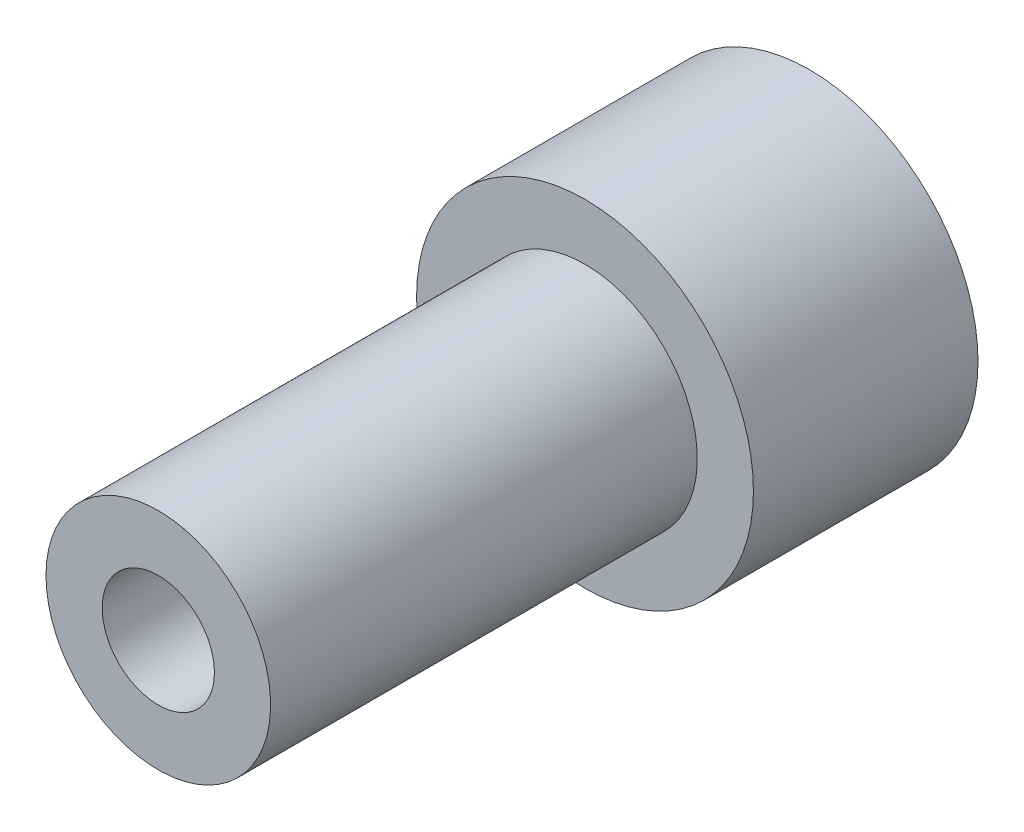
ISO-10303-21;
HEADER;
FILE_DESCRIPTION(('STEP AP214'),'2;1');
FILE_NAME('part.step','',(''),(''),'','','');
FILE_SCHEMA(('AUTOMOTIVE_DESIGN { 1 0 10303 214 1 1 1 1 }'));
ENDSEC;
DATA;
#1=APPLICATION_CONTEXT('core data for automotive mechanical design processes');
#2=APPLICATION_PROTOCOL_DEFINITION('international standard','automotive_design',2000,#1);
#3=PRODUCT_CONTEXT('',#1,'mechanical');
#4=PRODUCT('Part','Part','',(#3));
#5=PRODUCT_RELATED_PRODUCT_CATEGORY('part','',(#4));
#6=PRODUCT_DEFINITION_FORMATION('','',#4);
#7=PRODUCT_DEFINITION_CONTEXT('part definition',#1,'design');
#8=PRODUCT_DEFINITION('design','',#6,#7);
#9=PRODUCT_DEFINITION_SHAPE('','',#8);
#10=(LENGTH_UNIT() NAMED_UNIT(*) SI_UNIT(.MILLI.,.METRE.));
#11=(NAMED_UNIT(*) PLANE_ANGLE_UNIT() SI_UNIT($,.RADIAN.));
#12=(NAMED_UNIT(*) SI_UNIT($,.STERADIAN.) SOLID_ANGLE_UNIT());
#13=UNCERTAINTY_MEASURE_WITH_UNIT(LENGTH_MEASURE(1.E-05),#10,'distance_accuracy_value','');
#14=(GEOMETRIC_REPRESENTATION_CONTEXT(3) GLOBAL_UNCERTAINTY_ASSIGNED_CONTEXT((#13)) GLOBAL_UNIT_ASSIGNED_CONTEXT((#10,
#11,#12)) REPRESENTATION_CONTEXT('',''));
#15=CARTESIAN_POINT('',(0.,0.,0.));
#16=DIRECTION('',(0.,0.,1.));
#17=DIRECTION('',(1.,0.,0.));
#18=AXIS2_PLACEMENT_3D('',#15,#16,#17);
#19=CARTESIAN_POINT('',(0.,0.,250.));
#20=DIRECTION('',(0.,0.,-1.));
#21=DIRECTION('',(-1.,0.,0.));
#22=AXIS2_PLACEMENT_3D('',#19,#20,#21);
#23=CYLINDRICAL_SURFACE('',#22,7.5);
#24=CARTESIAN_POINT('',(0.,0.,10.));
#25=DIRECTION('',(0.,0.,-1.));
#26=DIRECTION('',(-1.,0.,0.));
#27=AXIS2_PLACEMENT_3D('',#24,#25,#26);
#28=CIRCLE('',#27,7.5);
#29=CARTESIAN_POINT('',(-7.5,0.,10.));
#30=VERTEX_POINT('',#29);
#31=EDGE_CURVE('E37',#30,#30,#28,.T.);
#32=ORIENTED_EDGE('',*,*,#31,.T.);
#33=EDGE_LOOP('',(#32));
#34=FACE_BOUND('',#33,.T.);
#35=CARTESIAN_POINT('',(0.,0.,0.));
#36=DIRECTION('',(0.,0.,1.));
#37=DIRECTION('',(1.,0.,0.));
#38=AXIS2_PLACEMENT_3D('',#35,#36,#37);
#39=CIRCLE('',#38,7.5);
#40=CARTESIAN_POINT('',(7.5,0.,0.));
#41=VERTEX_POINT('',#40);
#42=EDGE_CURVE('E10',#41,#41,#39,.T.);
#43=ORIENTED_EDGE('',*,*,#42,.T.);
#44=EDGE_LOOP('',(#43));
#45=FACE_BOUND('',#44,.T.);
#46=ADVANCED_FACE('F31',(#34,#45),#23,.T.);
#47=CARTESIAN_POINT('',(0.,0.,0.));
#48=DIRECTION('',(0.,0.,1.));
#49=DIRECTION('',(1.,0.,0.));
#50=AXIS2_PLACEMENT_3D('',#47,#48,#49);
#51=PLANE('',#50);
#52=ORIENTED_EDGE('',*,*,#42,.F.);
#53=EDGE_LOOP('',(#52));
#54=FACE_BOUND('',#53,.T.);
#55=ADVANCED_FACE('F80',(#54),#51,.F.);
#56=CARTESIAN_POINT('',(0.,0.,10.));
#57=DIRECTION('',(0.,0.,-1.));
#58=DIRECTION('',(-1.,0.,0.));
#59=AXIS2_PLACEMENT_3D('',#56,#57,#58);
#60=PLANE('',#59);
#61=CARTESIAN_POINT('',(0.,0.,10.));
#62=DIRECTION('',(0.,0.,-1.));
#63=DIRECTION('',(-1.,0.,0.));
#64=AXIS2_PLACEMENT_3D('',#61,#62,#63);
#65=CIRCLE('',#64,5.);
#66=CARTESIAN_POINT('',(-5.,0.,10.));
#67=VERTEX_POINT('',#66);
#68=EDGE_CURVE('E41',#67,#67,#65,.T.);
#69=ORIENTED_EDGE('',*,*,#68,.T.);
#70=EDGE_LOOP('',(#69));
#71=FACE_BOUND('',#70,.T.);
#72=ORIENTED_EDGE('',*,*,#31,.F.);
#73=EDGE_LOOP('',(#72));
#74=FACE_BOUND('',#73,.T.);
#75=ADVANCED_FACE('F74',(#71,#74),#60,.F.);
#76=CARTESIAN_POINT('',(0.,0.,29.));
#77=DIRECTION('',(0.,0.,-1.));
#78=DIRECTION('',(-1.,0.,0.));
#79=AXIS2_PLACEMENT_3D('',#76,#77,#78);
#80=CYLINDRICAL_SURFACE('',#79,5.);
#81=CARTESIAN_POINT('',(0.,0.,29.));
#82=DIRECTION('',(0.,0.,-1.));
#83=DIRECTION('',(-1.,0.,0.));
#84=AXIS2_PLACEMENT_3D('',#81,#82,#83);
#85=CIRCLE('',#84,5.);
#86=CARTESIAN_POINT('',(-5.,0.,29.));
#87=VERTEX_POINT('',#86);
#88=EDGE_CURVE('E45',#87,#87,#85,.F.);
#89=ORIENTED_EDGE('',*,*,#88,.F.);
#90=EDGE_LOOP('',(#89));
#91=FACE_BOUND('',#90,.T.);
#92=ORIENTED_EDGE('',*,*,#68,.F.);
#93=EDGE_LOOP('',(#92));
#94=FACE_BOUND('',#93,.T.);
#95=ADVANCED_FACE('F68',(#91,#94),#80,.T.);
#96=CARTESIAN_POINT('',(0.,0.,29.));
#97=DIRECTION('',(0.,0.,-1.));
#98=DIRECTION('',(-1.,0.,0.));
#99=AXIS2_PLACEMENT_3D('',#96,#97,#98);
#100=PLANE('',#99);
#101=CARTESIAN_POINT('',(0.,0.,29.));
#102=DIRECTION('',(0.,0.,1.));
#103=DIRECTION('',(1.,0.,0.));
#104=AXIS2_PLACEMENT_3D('',#101,#102,#103);
#105=CIRCLE('',#104,2.5);
#106=CARTESIAN_POINT('',(2.5,0.,29.));
#107=VERTEX_POINT('',#106);
#108=EDGE_CURVE('E51',#107,#107,#105,.T.);
#109=ORIENTED_EDGE('',*,*,#108,.F.);
#110=EDGE_LOOP('',(#109));
#111=FACE_BOUND('',#110,.T.);
#112=ORIENTED_EDGE('',*,*,#88,.T.);
#113=EDGE_LOOP('',(#112));
#114=FACE_BOUND('',#113,.T.);
#115=ADVANCED_FACE('F62',(#111,#114),#100,.F.);
#116=CARTESIAN_POINT('',(0.,0.,19.));
#117=DIRECTION('',(0.,0.,1.));
#118=DIRECTION('',(1.,0.,0.));
#119=AXIS2_PLACEMENT_3D('',#116,#117,#118);
#120=CYLINDRICAL_SURFACE('',#119,2.5);
#121=CARTESIAN_POINT('',(0.,0.,19.));
#122=DIRECTION('',(0.,0.,1.));
#123=DIRECTION('',(1.,0.,0.));
#124=AXIS2_PLACEMENT_3D('',#121,#122,#123);
#125=CIRCLE('',#124,2.5);
#126=CARTESIAN_POINT('',(2.5,0.,19.));
#127=VERTEX_POINT('',#126);
#128=EDGE_CURVE('E50',#127,#127,#125,.T.);
#129=ORIENTED_EDGE('',*,*,#128,.F.);
#130=EDGE_LOOP('',(#129));
#131=FACE_BOUND('',#130,.T.);
#132=ORIENTED_EDGE('',*,*,#108,.T.);
#133=EDGE_LOOP('',(#132));
#134=FACE_BOUND('',#133,.T.);
#135=ADVANCED_FACE('F59',(#131,#134),#120,.F.);
#136=CARTESIAN_POINT('',(0.,0.,19.));
#137=DIRECTION('',(0.,0.,1.));
#138=DIRECTION('',(1.,0.,0.));
#139=AXIS2_PLACEMENT_3D('',#136,#137,#138);
#140=PLANE('',#139);
#141=ORIENTED_EDGE('',*,*,#128,.T.);
#142=EDGE_LOOP('',(#141));
#143=FACE_BOUND('',#142,.T.);
#144=ADVANCED_FACE('F57',(#143),#140,.T.);
#145=CLOSED_SHELL('',(#46,#55,#75,#95,#115,#135,#144));
#146=MANIFOLD_SOLID_BREP('B2',#145);
#147=ADVANCED_BREP_SHAPE_REPRESENTATION('',(#18,#146),#14);
#148=SHAPE_DEFINITION_REPRESENTATION(#9,#147);
ENDSEC;
END-ISO-10303-21;
